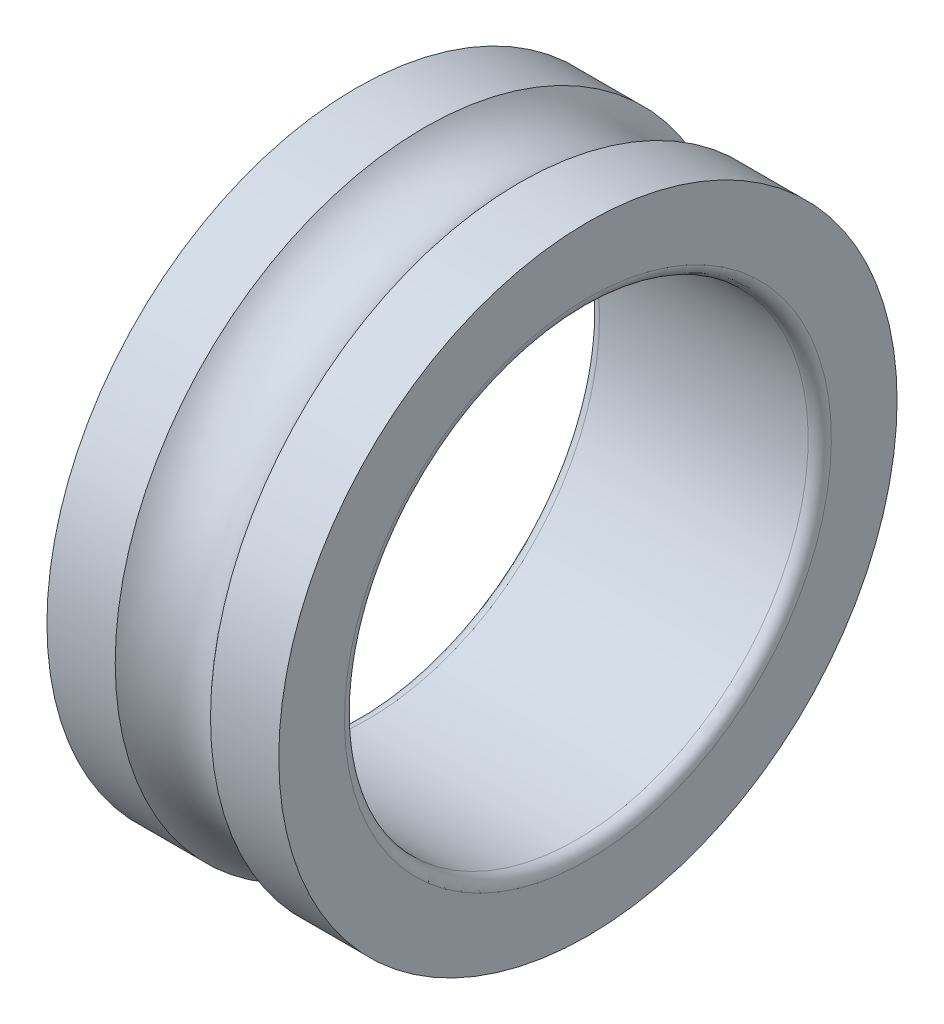
ISO-10303-21;
HEADER;
FILE_DESCRIPTION(('STEP AP214'),'2;1');
FILE_NAME('part.step','',(''),(''),'','','');
FILE_SCHEMA(('AUTOMOTIVE_DESIGN { 1 0 10303 214 1 1 1 1 }'));
ENDSEC;
DATA;
#1=APPLICATION_CONTEXT('core data for automotive mechanical design processes');
#2=APPLICATION_PROTOCOL_DEFINITION('international standard','automotive_design',2000,#1);
#3=PRODUCT_CONTEXT('',#1,'mechanical');
#4=PRODUCT('Part','Part','',(#3));
#5=PRODUCT_RELATED_PRODUCT_CATEGORY('part','',(#4));
#6=PRODUCT_DEFINITION_FORMATION('','',#4);
#7=PRODUCT_DEFINITION_CONTEXT('part definition',#1,'design');
#8=PRODUCT_DEFINITION('design','',#6,#7);
#9=PRODUCT_DEFINITION_SHAPE('','',#8);
#10=(LENGTH_UNIT() NAMED_UNIT(*) SI_UNIT(.MILLI.,.METRE.));
#11=(NAMED_UNIT(*) PLANE_ANGLE_UNIT() SI_UNIT($,.RADIAN.));
#12=(NAMED_UNIT(*) SI_UNIT($,.STERADIAN.) SOLID_ANGLE_UNIT());
#13=UNCERTAINTY_MEASURE_WITH_UNIT(LENGTH_MEASURE(1.E-05),#10,'distance_accuracy_value','');
#14=(GEOMETRIC_REPRESENTATION_CONTEXT(3) GLOBAL_UNCERTAINTY_ASSIGNED_CONTEXT((#13)) GLOBAL_UNIT_ASSIGNED_CONTEXT((#10,
#11,#12)) REPRESENTATION_CONTEXT('',''));
#15=CARTESIAN_POINT('',(0.,0.,0.));
#16=DIRECTION('',(0.,0.,1.));
#17=DIRECTION('',(1.,0.,0.));
#18=AXIS2_PLACEMENT_3D('',#15,#16,#17);
#19=CARTESIAN_POINT('',(5.11647308335401,0.,0.));
#20=DIRECTION('',(-1.,0.,0.));
#21=DIRECTION('',(0.,1.,0.));
#22=AXIS2_PLACEMENT_3D('',#19,#20,#21);
#23=CYLINDRICAL_SURFACE('',#22,8.);
#24=CARTESIAN_POINT('',(4.23294616670802,0.,0.));
#25=DIRECTION('',(1.,0.,0.));
#26=DIRECTION('',(0.,1.,0.));
#27=AXIS2_PLACEMENT_3D('',#24,#25,#26);
#28=CIRCLE('',#27,8.);
#29=CARTESIAN_POINT('',(4.23294616670802,8.,0.));
#30=VERTEX_POINT('',#29);
#31=EDGE_CURVE('E11',#30,#30,#28,.T.);
#32=ORIENTED_EDGE('',*,*,#31,.T.);
#33=EDGE_LOOP('',(#32));
#34=FACE_BOUND('',#33,.T.);
#35=CARTESIAN_POINT('',(6.,0.,0.));
#36=DIRECTION('',(1.,0.,0.));
#37=DIRECTION('',(0.,1.,0.));
#38=AXIS2_PLACEMENT_3D('',#35,#36,#37);
#39=CIRCLE('',#38,8.);
#40=CARTESIAN_POINT('',(6.,8.,0.));
#41=VERTEX_POINT('',#40);
#42=EDGE_CURVE('E50',#41,#41,#39,.T.);
#43=ORIENTED_EDGE('',*,*,#42,.F.);
#44=EDGE_LOOP('',(#43));
#45=FACE_BOUND('',#44,.T.);
#46=ADVANCED_FACE('F16',(#34,#45),#23,.T.);
#47=CARTESIAN_POINT('',(3.,0.,0.));
#48=DIRECTION('',(1.,0.,0.));
#49=DIRECTION('',(0.,0.,-1.));
#50=AXIS2_PLACEMENT_3D('',#47,#48,#49);
#51=TOROIDAL_SURFACE('',#50,9.,1.5875);
#52=CARTESIAN_POINT('',(1.76705383329198,0.,0.));
#53=DIRECTION('',(1.,0.,0.));
#54=DIRECTION('',(0.,1.,0.));
#55=AXIS2_PLACEMENT_3D('',#52,#53,#54);
#56=CIRCLE('',#55,8.);
#57=CARTESIAN_POINT('',(1.76705383329198,8.,0.));
#58=VERTEX_POINT('',#57);
#59=EDGE_CURVE('E26',#58,#58,#56,.T.);
#60=ORIENTED_EDGE('',*,*,#59,.T.);
#61=EDGE_LOOP('',(#60));
#62=FACE_BOUND('',#61,.T.);
#63=ORIENTED_EDGE('',*,*,#31,.F.);
#64=EDGE_LOOP('',(#63));
#65=FACE_BOUND('',#64,.T.);
#66=ADVANCED_FACE('F83',(#62,#65),#51,.F.);
#67=CARTESIAN_POINT('',(0.88352691664599,0.,0.));
#68=DIRECTION('',(-1.,0.,0.));
#69=DIRECTION('',(0.,1.,0.));
#70=AXIS2_PLACEMENT_3D('',#67,#68,#69);
#71=CYLINDRICAL_SURFACE('',#70,8.);
#72=CARTESIAN_POINT('',(0.,0.,0.));
#73=DIRECTION('',(1.,0.,0.));
#74=DIRECTION('',(0.,1.,0.));
#75=AXIS2_PLACEMENT_3D('',#72,#73,#74);
#76=CIRCLE('',#75,8.);
#77=CARTESIAN_POINT('',(0.,8.,0.));
#78=VERTEX_POINT('',#77);
#79=EDGE_CURVE('E59',#78,#78,#76,.T.);
#80=ORIENTED_EDGE('',*,*,#79,.T.);
#81=EDGE_LOOP('',(#80));
#82=FACE_BOUND('',#81,.T.);
#83=ORIENTED_EDGE('',*,*,#59,.F.);
#84=EDGE_LOOP('',(#83));
#85=FACE_BOUND('',#84,.T.);
#86=ADVANCED_FACE('F88',(#82,#85),#71,.T.);
#87=CARTESIAN_POINT('',(0.,7.15,0.));
#88=DIRECTION('',(-1.,0.,0.));
#89=DIRECTION('',(0.,-1.,0.));
#90=AXIS2_PLACEMENT_3D('',#87,#88,#89);
#91=PLANE('',#90);
#92=CARTESIAN_POINT('',(0.,0.,0.));
#93=DIRECTION('',(1.,0.,0.));
#94=DIRECTION('',(0.,1.,0.));
#95=AXIS2_PLACEMENT_3D('',#92,#93,#94);
#96=CIRCLE('',#95,6.3);
#97=CARTESIAN_POINT('',(0.,6.3,0.));
#98=VERTEX_POINT('',#97);
#99=EDGE_CURVE('E57',#98,#98,#96,.T.);
#100=ORIENTED_EDGE('',*,*,#99,.T.);
#101=EDGE_LOOP('',(#100));
#102=FACE_BOUND('',#101,.T.);
#103=ORIENTED_EDGE('',*,*,#79,.F.);
#104=EDGE_LOOP('',(#103));
#105=FACE_BOUND('',#104,.T.);
#106=ADVANCED_FACE('F80',(#102,#105),#91,.T.);
#107=CARTESIAN_POINT('',(0.3,0.,0.));
#108=DIRECTION('',(1.,0.,0.));
#109=DIRECTION('',(0.,0.,-1.));
#110=AXIS2_PLACEMENT_3D('',#107,#108,#109);
#111=TOROIDAL_SURFACE('',#110,6.3,0.3);
#112=CARTESIAN_POINT('',(0.3,0.,0.));
#113=DIRECTION('',(1.,0.,0.));
#114=DIRECTION('',(0.,1.,0.));
#115=AXIS2_PLACEMENT_3D('',#112,#113,#114);
#116=CIRCLE('',#115,6.);
#117=CARTESIAN_POINT('',(0.3,6.,0.));
#118=VERTEX_POINT('',#117);
#119=EDGE_CURVE('E54',#118,#118,#116,.T.);
#120=ORIENTED_EDGE('',*,*,#119,.T.);
#121=EDGE_LOOP('',(#120));
#122=FACE_BOUND('',#121,.T.);
#123=ORIENTED_EDGE('',*,*,#99,.F.);
#124=EDGE_LOOP('',(#123));
#125=FACE_BOUND('',#124,.T.);
#126=ADVANCED_FACE('F65',(#122,#125),#111,.T.);
#127=CARTESIAN_POINT('',(3.,0.,0.));
#128=DIRECTION('',(-1.,0.,0.));
#129=DIRECTION('',(0.,1.,0.));
#130=AXIS2_PLACEMENT_3D('',#127,#128,#129);
#131=CYLINDRICAL_SURFACE('',#130,6.);
#132=CARTESIAN_POINT('',(5.7,0.,0.));
#133=DIRECTION('',(1.,0.,0.));
#134=DIRECTION('',(0.,1.,0.));
#135=AXIS2_PLACEMENT_3D('',#132,#133,#134);
#136=CIRCLE('',#135,6.);
#137=CARTESIAN_POINT('',(5.7,6.,0.));
#138=VERTEX_POINT('',#137);
#139=EDGE_CURVE('E20',#138,#138,#136,.T.);
#140=ORIENTED_EDGE('',*,*,#139,.T.);
#141=EDGE_LOOP('',(#140));
#142=FACE_BOUND('',#141,.T.);
#143=ORIENTED_EDGE('',*,*,#119,.F.);
#144=EDGE_LOOP('',(#143));
#145=FACE_BOUND('',#144,.T.);
#146=ADVANCED_FACE('F68',(#142,#145),#131,.F.);
#147=CARTESIAN_POINT('',(5.7,0.,0.));
#148=DIRECTION('',(1.,0.,0.));
#149=DIRECTION('',(0.,0.,-1.));
#150=AXIS2_PLACEMENT_3D('',#147,#148,#149);
#151=TOROIDAL_SURFACE('',#150,6.3,0.3);
#152=CARTESIAN_POINT('',(6.,0.,0.));
#153=DIRECTION('',(1.,0.,0.));
#154=DIRECTION('',(0.,1.,0.));
#155=AXIS2_PLACEMENT_3D('',#152,#153,#154);
#156=CIRCLE('',#155,6.3);
#157=CARTESIAN_POINT('',(6.,6.3,0.));
#158=VERTEX_POINT('',#157);
#159=EDGE_CURVE('E53',#158,#158,#156,.T.);
#160=ORIENTED_EDGE('',*,*,#159,.T.);
#161=EDGE_LOOP('',(#160));
#162=FACE_BOUND('',#161,.T.);
#163=ORIENTED_EDGE('',*,*,#139,.F.);
#164=EDGE_LOOP('',(#163));
#165=FACE_BOUND('',#164,.T.);
#166=ADVANCED_FACE('F70',(#162,#165),#151,.T.);
#167=CARTESIAN_POINT('',(6.,7.15,0.));
#168=DIRECTION('',(1.,0.,0.));
#169=DIRECTION('',(0.,1.,0.));
#170=AXIS2_PLACEMENT_3D('',#167,#168,#169);
#171=PLANE('',#170);
#172=ORIENTED_EDGE('',*,*,#42,.T.);
#173=EDGE_LOOP('',(#172));
#174=FACE_BOUND('',#173,.T.);
#175=ORIENTED_EDGE('',*,*,#159,.F.);
#176=EDGE_LOOP('',(#175));
#177=FACE_BOUND('',#176,.T.);
#178=ADVANCED_FACE('F18',(#174,#177),#171,.T.);
#179=CLOSED_SHELL('',(#46,#66,#86,#106,#126,#146,#166,#178));
#180=MANIFOLD_SOLID_BREP('B1',#179);
#181=ADVANCED_BREP_SHAPE_REPRESENTATION('',(#18,#180),#14);
#182=SHAPE_DEFINITION_REPRESENTATION(#9,#181);
ENDSEC;
END-ISO-10303-21;
